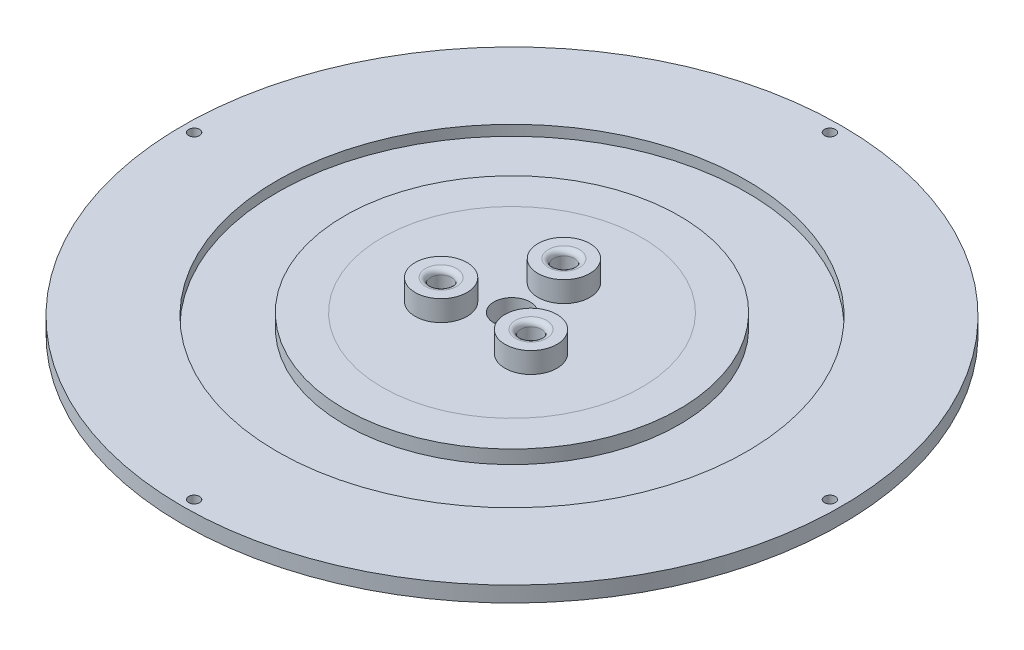
ISO-10303-21;
HEADER;
FILE_DESCRIPTION(('STEP AP214'),'2;1');
FILE_NAME('part.step','',(''),(''),'','','');
FILE_SCHEMA(('AUTOMOTIVE_DESIGN { 1 0 10303 214 1 1 1 1 }'));
ENDSEC;
DATA;
#1=APPLICATION_CONTEXT('core data for automotive mechanical design processes');
#2=APPLICATION_PROTOCOL_DEFINITION('international standard','automotive_design',2000,#1);
#3=PRODUCT_CONTEXT('',#1,'mechanical');
#4=PRODUCT('Part','Part','',(#3));
#5=PRODUCT_RELATED_PRODUCT_CATEGORY('part','',(#4));
#6=PRODUCT_DEFINITION_FORMATION('','',#4);
#7=PRODUCT_DEFINITION_CONTEXT('part definition',#1,'design');
#8=PRODUCT_DEFINITION('design','',#6,#7);
#9=PRODUCT_DEFINITION_SHAPE('','',#8);
#10=(LENGTH_UNIT() NAMED_UNIT(*) SI_UNIT(.MILLI.,.METRE.));
#11=(NAMED_UNIT(*) PLANE_ANGLE_UNIT() SI_UNIT($,.RADIAN.));
#12=(NAMED_UNIT(*) SI_UNIT($,.STERADIAN.) SOLID_ANGLE_UNIT());
#13=UNCERTAINTY_MEASURE_WITH_UNIT(LENGTH_MEASURE(1.E-05),#10,'distance_accuracy_value','');
#14=(GEOMETRIC_REPRESENTATION_CONTEXT(3) GLOBAL_UNCERTAINTY_ASSIGNED_CONTEXT((#13)) GLOBAL_UNIT_ASSIGNED_CONTEXT((#10,
#11,#12)) REPRESENTATION_CONTEXT('',''));
#15=CARTESIAN_POINT('',(0.,0.,0.));
#16=DIRECTION('',(0.,0.,1.));
#17=DIRECTION('',(1.,0.,0.));
#18=AXIS2_PLACEMENT_3D('',#15,#16,#17);
#19=CARTESIAN_POINT('',(0.,14.6,0.));
#20=DIRECTION('',(0.,1.,0.));
#21=DIRECTION('',(0.,0.,1.));
#22=AXIS2_PLACEMENT_3D('',#19,#20,#21);
#23=PLANE('',#22);
#24=CARTESIAN_POINT('',(0.,14.6,0.));
#25=DIRECTION('',(0.,1.,0.));
#26=DIRECTION('',(0.,0.,1.));
#27=AXIS2_PLACEMENT_3D('',#24,#25,#26);
#28=CIRCLE('',#27,32.25);
#29=CARTESIAN_POINT('',(0.,14.6,32.25));
#30=VERTEX_POINT('',#29);
#31=EDGE_CURVE('E86',#30,#30,#28,.T.);
#32=ORIENTED_EDGE('',*,*,#31,.T.);
#33=EDGE_LOOP('',(#32));
#34=FACE_BOUND('',#33,.T.);
#35=CARTESIAN_POINT('',(0.,14.6,0.));
#36=DIRECTION('',(0.,1.,0.));
#37=DIRECTION('',(0.,0.,1.));
#38=AXIS2_PLACEMENT_3D('',#35,#36,#37);
#39=CIRCLE('',#38,25.);
#40=CARTESIAN_POINT('',(0.,14.6,25.));
#41=VERTEX_POINT('',#40);
#42=EDGE_CURVE('E11',#41,#41,#39,.F.);
#43=ORIENTED_EDGE('',*,*,#42,.T.);
#44=EDGE_LOOP('',(#43));
#45=FACE_BOUND('',#44,.T.);
#46=ADVANCED_FACE('F49',(#34,#45),#23,.T.);
#47=CARTESIAN_POINT('',(0.,6.,0.));
#48=DIRECTION('',(0.,1.,0.));
#49=DIRECTION('',(0.,0.,1.));
#50=AXIS2_PLACEMENT_3D('',#47,#48,#49);
#51=CYLINDRICAL_SURFACE('',#50,63.5);
#52=CARTESIAN_POINT('',(0.,14.,0.));
#53=DIRECTION('',(0.,1.,0.));
#54=DIRECTION('',(0.,0.,1.));
#55=AXIS2_PLACEMENT_3D('',#52,#53,#54);
#56=CIRCLE('',#55,63.5);
#57=CARTESIAN_POINT('',(0.,14.,63.5));
#58=VERTEX_POINT('',#57);
#59=EDGE_CURVE('E77',#58,#58,#56,.T.);
#60=ORIENTED_EDGE('',*,*,#59,.F.);
#61=EDGE_LOOP('',(#60));
#62=FACE_BOUND('',#61,.T.);
#63=CARTESIAN_POINT('',(0.,11.,0.));
#64=DIRECTION('',(0.,1.,0.));
#65=DIRECTION('',(0.,0.,1.));
#66=AXIS2_PLACEMENT_3D('',#63,#64,#65);
#67=CIRCLE('',#66,63.5);
#68=CARTESIAN_POINT('',(0.,11.,63.5));
#69=VERTEX_POINT('',#68);
#70=EDGE_CURVE('E83',#69,#69,#67,.F.);
#71=ORIENTED_EDGE('',*,*,#70,.F.);
#72=EDGE_LOOP('',(#71));
#73=FACE_BOUND('',#72,.T.);
#74=ADVANCED_FACE('F163',(#62,#73),#51,.T.);
#75=ORIENTED_EDGE('',*,*,#42,.F.);
#76=EDGE_LOOP('',(#75));
#77=FACE_BOUND('',#76,.T.);
#78=CARTESIAN_POINT('',(0.,14.6,0.));
#79=DIRECTION('',(0.,1.,0.));
#80=DIRECTION('',(0.,0.,1.));
#81=AXIS2_PLACEMENT_3D('',#78,#79,#80);
#82=CIRCLE('',#81,3.5);
#83=CARTESIAN_POINT('',(0.,14.6,3.5));
#84=VERTEX_POINT('',#83);
#85=EDGE_CURVE('E82',#84,#84,#82,.T.);
#86=ORIENTED_EDGE('',*,*,#85,.F.);
#87=EDGE_LOOP('',(#86));
#88=FACE_BOUND('',#87,.T.);
#89=CARTESIAN_POINT('',(0.,14.6,-10.));
#90=DIRECTION('',(0.,1.,0.));
#91=DIRECTION('',(0.,0.,1.));
#92=AXIS2_PLACEMENT_3D('',#89,#90,#91);
#93=CIRCLE('',#92,5.);
#94=CARTESIAN_POINT('',(0.,14.6,-5.));
#95=VERTEX_POINT('',#94);
#96=EDGE_CURVE('E185',#95,#95,#93,.T.);
#97=ORIENTED_EDGE('',*,*,#96,.F.);
#98=EDGE_LOOP('',(#97));
#99=FACE_BOUND('',#98,.T.);
#100=CARTESIAN_POINT('',(-8.66025403784437,14.6,5.00000000000004));
#101=DIRECTION('',(0.,1.,0.));
#102=DIRECTION('',(0.866025403784436,0.,-0.500000000000004));
#103=AXIS2_PLACEMENT_3D('',#100,#101,#102);
#104=CIRCLE('',#103,5.);
#105=CARTESIAN_POINT('',(-4.33012701892218,14.6,2.50000000000002));
#106=VERTEX_POINT('',#105);
#107=EDGE_CURVE('E189',#106,#106,#104,.T.);
#108=ORIENTED_EDGE('',*,*,#107,.F.);
#109=EDGE_LOOP('',(#108));
#110=FACE_BOUND('',#109,.T.);
#111=CARTESIAN_POINT('',(8.66025403784443,14.6,4.99999999999992));
#112=DIRECTION('',(0.,1.,0.));
#113=DIRECTION('',(-0.866025403784443,0.,-0.499999999999992));
#114=AXIS2_PLACEMENT_3D('',#111,#112,#113);
#115=CIRCLE('',#114,5.);
#116=CARTESIAN_POINT('',(4.33012701892222,14.6,2.49999999999996));
#117=VERTEX_POINT('',#116);
#118=EDGE_CURVE('E192',#117,#117,#115,.T.);
#119=ORIENTED_EDGE('',*,*,#118,.F.);
#120=EDGE_LOOP('',(#119));
#121=FACE_BOUND('',#120,.T.);
#122=ADVANCED_FACE('F152',(#77,#88,#99,#110,#121),#23,.T.);
#123=CARTESIAN_POINT('',(0.,14.,0.));
#124=DIRECTION('',(0.,1.,0.));
#125=DIRECTION('',(0.,0.,1.));
#126=AXIS2_PLACEMENT_3D('',#123,#124,#125);
#127=PLANE('',#126);
#128=CARTESIAN_POINT('',(0.,14.,61.25));
#129=DIRECTION('',(0.,1.,0.));
#130=DIRECTION('',(0.,0.,1.));
#131=AXIS2_PLACEMENT_3D('',#128,#129,#130);
#132=CIRCLE('',#131,1.05);
#133=CARTESIAN_POINT('',(0.,14.,62.3));
#134=VERTEX_POINT('',#133);
#135=EDGE_CURVE('E447',#134,#134,#132,.T.);
#136=ORIENTED_EDGE('',*,*,#135,.F.);
#137=EDGE_LOOP('',(#136));
#138=FACE_BOUND('',#137,.T.);
#139=CARTESIAN_POINT('',(-61.25,14.,0.));
#140=DIRECTION('',(0.,1.,0.));
#141=DIRECTION('',(0.,0.,1.));
#142=AXIS2_PLACEMENT_3D('',#139,#140,#141);
#143=CIRCLE('',#142,1.05);
#144=CARTESIAN_POINT('',(-61.25,14.,1.05000000000002));
#145=VERTEX_POINT('',#144);
#146=EDGE_CURVE('E455',#145,#145,#143,.T.);
#147=ORIENTED_EDGE('',*,*,#146,.F.);
#148=EDGE_LOOP('',(#147));
#149=FACE_BOUND('',#148,.T.);
#150=CARTESIAN_POINT('',(0.,14.,-61.25));
#151=DIRECTION('',(0.,1.,0.));
#152=DIRECTION('',(0.,0.,1.));
#153=AXIS2_PLACEMENT_3D('',#150,#151,#152);
#154=CIRCLE('',#153,1.05);
#155=CARTESIAN_POINT('',(0.,14.,-60.2));
#156=VERTEX_POINT('',#155);
#157=EDGE_CURVE('E465',#156,#156,#154,.T.);
#158=ORIENTED_EDGE('',*,*,#157,.F.);
#159=EDGE_LOOP('',(#158));
#160=FACE_BOUND('',#159,.T.);
#161=CARTESIAN_POINT('',(61.25,14.,0.));
#162=DIRECTION('',(0.,1.,0.));
#163=DIRECTION('',(0.,0.,1.));
#164=AXIS2_PLACEMENT_3D('',#161,#162,#163);
#165=CIRCLE('',#164,1.05);
#166=CARTESIAN_POINT('',(61.25,14.,1.04999999999998));
#167=VERTEX_POINT('',#166);
#168=EDGE_CURVE('E473',#167,#167,#165,.T.);
#169=ORIENTED_EDGE('',*,*,#168,.F.);
#170=EDGE_LOOP('',(#169));
#171=FACE_BOUND('',#170,.T.);
#172=ORIENTED_EDGE('',*,*,#59,.T.);
#173=EDGE_LOOP('',(#172));
#174=FACE_BOUND('',#173,.T.);
#175=CARTESIAN_POINT('',(0.,14.,0.));
#176=DIRECTION('',(0.,1.,0.));
#177=DIRECTION('',(0.,0.,1.));
#178=AXIS2_PLACEMENT_3D('',#175,#176,#177);
#179=CIRCLE('',#178,45.25);
#180=CARTESIAN_POINT('',(0.,14.,45.25));
#181=VERTEX_POINT('',#180);
#182=EDGE_CURVE('E73',#181,#181,#179,.T.);
#183=ORIENTED_EDGE('',*,*,#182,.F.);
#184=EDGE_LOOP('',(#183));
#185=FACE_BOUND('',#184,.T.);
#186=ADVANCED_FACE('F51',(#138,#149,#160,#171,#174,#185),#127,.T.);
#187=CARTESIAN_POINT('',(0.,11.,0.));
#188=DIRECTION('',(0.,1.,0.));
#189=DIRECTION('',(0.,0.,1.));
#190=AXIS2_PLACEMENT_3D('',#187,#188,#189);
#191=PLANE('',#190);
#192=CARTESIAN_POINT('',(0.,11.,61.25));
#193=DIRECTION('',(0.,1.,0.));
#194=DIRECTION('',(0.,0.,1.));
#195=AXIS2_PLACEMENT_3D('',#192,#193,#194);
#196=CIRCLE('',#195,1.05);
#197=CARTESIAN_POINT('',(0.,11.,62.3));
#198=VERTEX_POINT('',#197);
#199=EDGE_CURVE('E87',#198,#198,#196,.T.);
#200=ORIENTED_EDGE('',*,*,#199,.T.);
#201=EDGE_LOOP('',(#200));
#202=FACE_BOUND('',#201,.T.);
#203=CARTESIAN_POINT('',(-61.25,11.,0.));
#204=DIRECTION('',(0.,1.,0.));
#205=DIRECTION('',(0.,0.,1.));
#206=AXIS2_PLACEMENT_3D('',#203,#204,#205);
#207=CIRCLE('',#206,1.05);
#208=CARTESIAN_POINT('',(-61.25,11.,1.05000000000002));
#209=VERTEX_POINT('',#208);
#210=EDGE_CURVE('E449',#209,#209,#207,.T.);
#211=ORIENTED_EDGE('',*,*,#210,.T.);
#212=EDGE_LOOP('',(#211));
#213=FACE_BOUND('',#212,.T.);
#214=CARTESIAN_POINT('',(0.,11.,-61.25));
#215=DIRECTION('',(0.,1.,0.));
#216=DIRECTION('',(0.,0.,1.));
#217=AXIS2_PLACEMENT_3D('',#214,#215,#216);
#218=CIRCLE('',#217,1.05);
#219=CARTESIAN_POINT('',(0.,11.,-60.2));
#220=VERTEX_POINT('',#219);
#221=EDGE_CURVE('E461',#220,#220,#218,.T.);
#222=ORIENTED_EDGE('',*,*,#221,.T.);
#223=EDGE_LOOP('',(#222));
#224=FACE_BOUND('',#223,.T.);
#225=CARTESIAN_POINT('',(61.25,11.,0.));
#226=DIRECTION('',(0.,1.,0.));
#227=DIRECTION('',(0.,0.,1.));
#228=AXIS2_PLACEMENT_3D('',#225,#226,#227);
#229=CIRCLE('',#228,1.05);
#230=CARTESIAN_POINT('',(61.25,11.,1.04999999999998));
#231=VERTEX_POINT('',#230);
#232=EDGE_CURVE('E469',#231,#231,#229,.T.);
#233=ORIENTED_EDGE('',*,*,#232,.T.);
#234=EDGE_LOOP('',(#233));
#235=FACE_BOUND('',#234,.T.);
#236=CARTESIAN_POINT('',(0.,11.,0.));
#237=DIRECTION('',(0.,1.,0.));
#238=DIRECTION('',(0.,0.,1.));
#239=AXIS2_PLACEMENT_3D('',#236,#237,#238);
#240=CIRCLE('',#239,3.5);
#241=CARTESIAN_POINT('',(0.,11.,3.5));
#242=VERTEX_POINT('',#241);
#243=EDGE_CURVE('E78',#242,#242,#240,.T.);
#244=ORIENTED_EDGE('',*,*,#243,.T.);
#245=EDGE_LOOP('',(#244));
#246=FACE_BOUND('',#245,.T.);
#247=ORIENTED_EDGE('',*,*,#70,.T.);
#248=EDGE_LOOP('',(#247));
#249=FACE_BOUND('',#248,.T.);
#250=ADVANCED_FACE('F176',(#202,#213,#224,#235,#246,#249),#191,.F.);
#251=CARTESIAN_POINT('',(0.,16.6,0.));
#252=DIRECTION('',(0.,-1.,0.));
#253=DIRECTION('',(0.,0.,-1.));
#254=AXIS2_PLACEMENT_3D('',#251,#252,#253);
#255=CYLINDRICAL_SURFACE('',#254,45.25);
#256=ORIENTED_EDGE('',*,*,#182,.T.);
#257=EDGE_LOOP('',(#256));
#258=FACE_BOUND('',#257,.T.);
#259=CARTESIAN_POINT('',(0.,12.,0.));
#260=DIRECTION('',(0.,1.,0.));
#261=DIRECTION('',(0.,0.,1.));
#262=AXIS2_PLACEMENT_3D('',#259,#260,#261);
#263=CIRCLE('',#262,45.25);
#264=CARTESIAN_POINT('',(0.,12.,45.25));
#265=VERTEX_POINT('',#264);
#266=EDGE_CURVE('E196',#265,#265,#263,.T.);
#267=ORIENTED_EDGE('',*,*,#266,.F.);
#268=EDGE_LOOP('',(#267));
#269=FACE_BOUND('',#268,.T.);
#270=ADVANCED_FACE('F234',(#258,#269),#255,.F.);
#271=CARTESIAN_POINT('',(0.,6.,0.));
#272=DIRECTION('',(0.,1.,0.));
#273=DIRECTION('',(0.,0.,1.));
#274=AXIS2_PLACEMENT_3D('',#271,#272,#273);
#275=CYLINDRICAL_SURFACE('',#274,3.5);
#276=CARTESIAN_POINT('',(0.,14.6,3.5));
#277=CARTESIAN_POINT('',(0.,14.5625,3.5));
#278=CARTESIAN_POINT('',(0.,14.525,3.5));
#279=CARTESIAN_POINT('',(0.,14.45,3.5));
#280=CARTESIAN_POINT('',(0.,14.4125,3.5));
#281=CARTESIAN_POINT('',(0.,14.3375,3.5));
#282=CARTESIAN_POINT('',(0.,14.3,3.5));
#283=CARTESIAN_POINT('',(0.,14.225,3.5));
#284=CARTESIAN_POINT('',(0.,14.1875,3.5));
#285=CARTESIAN_POINT('',(0.,14.1125,3.5));
#286=CARTESIAN_POINT('',(0.,14.075,3.5));
#287=CARTESIAN_POINT('',(0.,14.,3.5));
#288=CARTESIAN_POINT('',(0.,13.9625,3.5));
#289=CARTESIAN_POINT('',(0.,13.8875,3.5));
#290=CARTESIAN_POINT('',(0.,13.85,3.5));
#291=CARTESIAN_POINT('',(0.,13.775,3.5));
#292=CARTESIAN_POINT('',(0.,13.7375,3.5));
#293=CARTESIAN_POINT('',(0.,13.6625,3.5));
#294=CARTESIAN_POINT('',(0.,13.625,3.5));
#295=CARTESIAN_POINT('',(0.,13.55,3.5));
#296=CARTESIAN_POINT('',(0.,13.5125,3.5));
#297=CARTESIAN_POINT('',(0.,13.4375,3.5));
#298=CARTESIAN_POINT('',(0.,13.4,3.5));
#299=CARTESIAN_POINT('',(0.,13.325,3.5));
#300=CARTESIAN_POINT('',(0.,13.2875,3.5));
#301=CARTESIAN_POINT('',(0.,13.2125,3.5));
#302=CARTESIAN_POINT('',(0.,13.175,3.5));
#303=CARTESIAN_POINT('',(0.,13.1,3.5));
#304=CARTESIAN_POINT('',(0.,13.0625,3.5));
#305=CARTESIAN_POINT('',(0.,12.9875,3.5));
#306=CARTESIAN_POINT('',(0.,12.95,3.5));
#307=CARTESIAN_POINT('',(0.,12.875,3.5));
#308=CARTESIAN_POINT('',(0.,12.8375,3.5));
#309=CARTESIAN_POINT('',(0.,12.7625,3.5));
#310=CARTESIAN_POINT('',(0.,12.725,3.5));
#311=CARTESIAN_POINT('',(0.,12.65,3.5));
#312=CARTESIAN_POINT('',(0.,12.6125,3.5));
#313=CARTESIAN_POINT('',(0.,12.5375,3.5));
#314=CARTESIAN_POINT('',(0.,12.5,3.5));
#315=CARTESIAN_POINT('',(0.,12.425,3.5));
#316=CARTESIAN_POINT('',(0.,12.3875,3.5));
#317=CARTESIAN_POINT('',(0.,12.3125,3.5));
#318=CARTESIAN_POINT('',(0.,12.275,3.5));
#319=CARTESIAN_POINT('',(0.,12.2,3.5));
#320=CARTESIAN_POINT('',(0.,12.1625,3.5));
#321=CARTESIAN_POINT('',(0.,12.0875,3.5));
#322=CARTESIAN_POINT('',(0.,12.05,3.5));
#323=CARTESIAN_POINT('',(0.,11.975,3.5));
#324=CARTESIAN_POINT('',(0.,11.9375,3.5));
#325=CARTESIAN_POINT('',(0.,11.8625,3.5));
#326=CARTESIAN_POINT('',(0.,11.825,3.5));
#327=CARTESIAN_POINT('',(0.,11.75,3.5));
#328=CARTESIAN_POINT('',(0.,11.7125,3.5));
#329=CARTESIAN_POINT('',(0.,11.6375,3.5));
#330=CARTESIAN_POINT('',(0.,11.6,3.5));
#331=CARTESIAN_POINT('',(0.,11.525,3.5));
#332=CARTESIAN_POINT('',(0.,11.4875,3.5));
#333=CARTESIAN_POINT('',(0.,11.4125,3.5));
#334=CARTESIAN_POINT('',(0.,11.375,3.5));
#335=CARTESIAN_POINT('',(0.,11.3,3.5));
#336=CARTESIAN_POINT('',(0.,11.2625,3.5));
#337=CARTESIAN_POINT('',(0.,11.1875,3.5));
#338=CARTESIAN_POINT('',(0.,11.15,3.5));
#339=CARTESIAN_POINT('',(0.,11.075,3.5));
#340=CARTESIAN_POINT('',(0.,11.0375,3.5));
#341=CARTESIAN_POINT('',(0.,11.,3.5));
#342=B_SPLINE_CURVE_WITH_KNOTS('',3,(#276,#277,#278,#279,#280,#281,#282,#283,#284,#285,#286,
#287,#288,#289,#290,#291,#292,#293,#294,#295,#296,#297,#298,#299,#300,#301,#302,#303,#304,#305,
#306,#307,#308,#309,#310,#311,#312,#313,#314,#315,#316,#317,#318,#319,#320,#321,#322,#323,#324,
#325,#326,#327,#328,#329,#330,#331,#332,#333,#334,#335,#336,#337,#338,#339,#340,#341),
.UNSPECIFIED.,.F.,.F.,(4,2,2,2,2,2,2,2,2,2,2,2,2,2,2,2,2,2,2,2,2,2,2,2,2,2,2,2,2,2,2,2,4),(0.,
0.1125,0.225,0.337499999999999,0.450000000000001,0.5625,0.675,0.7875,0.899999999999998,1.0125,
1.125,1.2375,1.35,1.4625,1.575,1.6875,1.8,1.9125,2.025,2.1375,2.25,2.3625,2.475,2.5875,2.7,
2.8125,2.925,3.0375,3.15,3.2625,3.375,3.4875,3.6),.UNSPECIFIED.);
#343=EDGE_CURVE('BSEAM228',#84,#242,#342,.T.);
#344=ORIENTED_EDGE('',*,*,#85,.T.);
#345=ORIENTED_EDGE('',*,*,#243,.F.);
#346=ORIENTED_EDGE('',*,*,#343,.T.);
#347=ORIENTED_EDGE('',*,*,#343,.F.);
#348=EDGE_LOOP('',(#344,#346,#345,#347));
#349=FACE_BOUND('',#348,.T.);
#350=ADVANCED_FACE('F228',(#349),#275,.F.);
#351=CARTESIAN_POINT('',(0.,18.6,-10.));
#352=DIRECTION('',(0.,1.,0.));
#353=DIRECTION('',(0.,0.,1.));
#354=AXIS2_PLACEMENT_3D('',#351,#352,#353);
#355=PLANE('',#354);
#356=CARTESIAN_POINT('',(0.,18.6,-10.));
#357=DIRECTION('',(0.,1.,0.));
#358=DIRECTION('',(0.,0.,1.));
#359=AXIS2_PLACEMENT_3D('',#356,#357,#358);
#360=CIRCLE('',#359,3.);
#361=CARTESIAN_POINT('',(0.,18.6,-7.));
#362=VERTEX_POINT('',#361);
#363=EDGE_CURVE('E101',#362,#362,#360,.F.);
#364=ORIENTED_EDGE('',*,*,#363,.T.);
#365=EDGE_LOOP('',(#364));
#366=FACE_BOUND('',#365,.T.);
#367=CARTESIAN_POINT('',(0.,18.6,-10.));
#368=DIRECTION('',(0.,1.,0.));
#369=DIRECTION('',(0.,0.,1.));
#370=AXIS2_PLACEMENT_3D('',#367,#368,#369);
#371=CIRCLE('',#370,5.);
#372=CARTESIAN_POINT('',(0.,18.6,-5.));
#373=VERTEX_POINT('',#372);
#374=EDGE_CURVE('E212',#373,#373,#371,.T.);
#375=ORIENTED_EDGE('',*,*,#374,.T.);
#376=EDGE_LOOP('',(#375));
#377=FACE_BOUND('',#376,.T.);
#378=ADVANCED_FACE('F219',(#366,#377),#355,.T.);
#379=CARTESIAN_POINT('',(0.,18.6,-10.));
#380=DIRECTION('',(0.,-1.,0.));
#381=DIRECTION('',(0.,0.,-1.));
#382=AXIS2_PLACEMENT_3D('',#379,#380,#381);
#383=CYLINDRICAL_SURFACE('',#382,5.);
#384=ORIENTED_EDGE('',*,*,#374,.F.);
#385=EDGE_LOOP('',(#384));
#386=FACE_BOUND('',#385,.T.);
#387=ORIENTED_EDGE('',*,*,#96,.T.);
#388=EDGE_LOOP('',(#387));
#389=FACE_BOUND('',#388,.T.);
#390=ADVANCED_FACE('F217',(#386,#389),#383,.T.);
#391=CARTESIAN_POINT('',(0.,18.6,-10.));
#392=DIRECTION('',(0.,-1.,0.));
#393=DIRECTION('',(0.,0.,-1.));
#394=AXIS2_PLACEMENT_3D('',#391,#392,#393);
#395=CYLINDRICAL_SURFACE('',#394,2.);
#396=CARTESIAN_POINT('',(0.,17.6,-10.));
#397=DIRECTION('',(0.,1.,0.));
#398=DIRECTION('',(0.,0.,1.));
#399=AXIS2_PLACEMENT_3D('',#396,#397,#398);
#400=CIRCLE('',#399,2.);
#401=CARTESIAN_POINT('',(0.,17.6,-8.));
#402=VERTEX_POINT('',#401);
#403=EDGE_CURVE('E95',#402,#402,#400,.T.);
#404=ORIENTED_EDGE('',*,*,#403,.T.);
#405=EDGE_LOOP('',(#404));
#406=FACE_BOUND('',#405,.T.);
#407=CARTESIAN_POINT('',(0.,14.6,-10.));
#408=DIRECTION('',(0.,1.,0.));
#409=DIRECTION('',(0.,0.,1.));
#410=AXIS2_PLACEMENT_3D('',#407,#408,#409);
#411=CIRCLE('',#410,2.);
#412=CARTESIAN_POINT('',(0.,14.6,-8.));
#413=VERTEX_POINT('',#412);
#414=EDGE_CURVE('E90',#413,#413,#411,.F.);
#415=ORIENTED_EDGE('',*,*,#414,.T.);
#416=EDGE_LOOP('',(#415));
#417=FACE_BOUND('',#416,.T.);
#418=ADVANCED_FACE('F157',(#406,#417),#395,.F.);
#419=ORIENTED_EDGE('',*,*,#414,.F.);
#420=EDGE_LOOP('',(#419));
#421=FACE_BOUND('',#420,.T.);
#422=ADVANCED_FACE('F146',(#421),#23,.T.);
#423=CARTESIAN_POINT('',(0.,17.6,-10.));
#424=DIRECTION('',(0.,1.,0.));
#425=DIRECTION('',(0.,0.,1.));
#426=AXIS2_PLACEMENT_3D('',#423,#424,#425);
#427=TOROIDAL_SURFACE('',#426,3.,1.);
#428=ORIENTED_EDGE('',*,*,#363,.F.);
#429=EDGE_LOOP('',(#428));
#430=FACE_BOUND('',#429,.T.);
#431=ORIENTED_EDGE('',*,*,#403,.F.);
#432=EDGE_LOOP('',(#431));
#433=FACE_BOUND('',#432,.T.);
#434=ADVANCED_FACE('F156',(#430,#433),#427,.T.);
#435=CARTESIAN_POINT('',(-8.66025403784437,18.6,5.00000000000004));
#436=DIRECTION('',(0.,1.,0.));
#437=DIRECTION('',(0.866025403784436,0.,-0.500000000000004));
#438=AXIS2_PLACEMENT_3D('',#435,#436,#437);
#439=PLANE('',#438);
#440=CARTESIAN_POINT('',(-8.66025403784437,18.6,5.00000000000004));
#441=DIRECTION('',(0.,1.,0.));
#442=DIRECTION('',(0.,0.,1.));
#443=AXIS2_PLACEMENT_3D('',#440,#441,#442);
#444=CIRCLE('',#443,3.);
#445=CARTESIAN_POINT('',(-8.66025403784437,18.6,8.00000000000004));
#446=VERTEX_POINT('',#445);
#447=EDGE_CURVE('E69',#446,#446,#444,.F.);
#448=ORIENTED_EDGE('',*,*,#447,.T.);
#449=EDGE_LOOP('',(#448));
#450=FACE_BOUND('',#449,.T.);
#451=CARTESIAN_POINT('',(-8.66025403784437,18.6,5.00000000000004));
#452=DIRECTION('',(0.,1.,0.));
#453=DIRECTION('',(0.866025403784436,0.,-0.500000000000004));
#454=AXIS2_PLACEMENT_3D('',#451,#452,#453);
#455=CIRCLE('',#454,5.);
#456=CARTESIAN_POINT('',(-4.33012701892218,18.6,2.50000000000002));
#457=VERTEX_POINT('',#456);
#458=EDGE_CURVE('E206',#457,#457,#455,.T.);
#459=ORIENTED_EDGE('',*,*,#458,.T.);
#460=EDGE_LOOP('',(#459));
#461=FACE_BOUND('',#460,.T.);
#462=ADVANCED_FACE('F124',(#450,#461),#439,.T.);
#463=CARTESIAN_POINT('',(-8.66025403784437,18.6,5.00000000000004));
#464=DIRECTION('',(0.,-1.,0.));
#465=DIRECTION('',(0.,0.,-1.));
#466=AXIS2_PLACEMENT_3D('',#463,#464,#465);
#467=CYLINDRICAL_SURFACE('',#466,5.);
#468=ORIENTED_EDGE('',*,*,#458,.F.);
#469=EDGE_LOOP('',(#468));
#470=FACE_BOUND('',#469,.T.);
#471=ORIENTED_EDGE('',*,*,#107,.T.);
#472=EDGE_LOOP('',(#471));
#473=FACE_BOUND('',#472,.T.);
#474=ADVANCED_FACE('F139',(#470,#473),#467,.T.);
#475=CARTESIAN_POINT('',(-8.66025403784437,18.6,5.00000000000004));
#476=DIRECTION('',(0.,-1.,0.));
#477=DIRECTION('',(0.,0.,-1.));
#478=AXIS2_PLACEMENT_3D('',#475,#476,#477);
#479=CYLINDRICAL_SURFACE('',#478,2.);
#480=CARTESIAN_POINT('',(-8.66025403784437,17.6,5.00000000000004));
#481=DIRECTION('',(0.,1.,0.));
#482=DIRECTION('',(0.,0.,1.));
#483=AXIS2_PLACEMENT_3D('',#480,#481,#482);
#484=CIRCLE('',#483,2.);
#485=CARTESIAN_POINT('',(-8.66025403784437,17.6,7.00000000000004));
#486=VERTEX_POINT('',#485);
#487=EDGE_CURVE('E117',#486,#486,#484,.T.);
#488=ORIENTED_EDGE('',*,*,#487,.T.);
#489=EDGE_LOOP('',(#488));
#490=FACE_BOUND('',#489,.T.);
#491=CARTESIAN_POINT('',(-8.66025403784437,14.6,5.00000000000004));
#492=DIRECTION('',(0.,1.,0.));
#493=DIRECTION('',(0.,0.,1.));
#494=AXIS2_PLACEMENT_3D('',#491,#492,#493);
#495=CIRCLE('',#494,2.);
#496=CARTESIAN_POINT('',(-8.66025403784437,14.6,7.00000000000004));
#497=VERTEX_POINT('',#496);
#498=EDGE_CURVE('E109',#497,#497,#495,.F.);
#499=ORIENTED_EDGE('',*,*,#498,.T.);
#500=EDGE_LOOP('',(#499));
#501=FACE_BOUND('',#500,.T.);
#502=ADVANCED_FACE('F135',(#490,#501),#479,.F.);
#503=ORIENTED_EDGE('',*,*,#498,.F.);
#504=EDGE_LOOP('',(#503));
#505=FACE_BOUND('',#504,.T.);
#506=ADVANCED_FACE('F138',(#505),#23,.T.);
#507=CARTESIAN_POINT('',(8.66025403784443,18.6,4.99999999999992));
#508=DIRECTION('',(0.,1.,0.));
#509=DIRECTION('',(-0.866025403784443,0.,-0.499999999999992));
#510=AXIS2_PLACEMENT_3D('',#507,#508,#509);
#511=PLANE('',#510);
#512=CARTESIAN_POINT('',(8.66025403784443,18.6,4.99999999999992));
#513=DIRECTION('',(0.,1.,0.));
#514=DIRECTION('',(0.,0.,1.));
#515=AXIS2_PLACEMENT_3D('',#512,#513,#514);
#516=CIRCLE('',#515,3.);
#517=CARTESIAN_POINT('',(8.66025403784443,18.6,7.99999999999992));
#518=VERTEX_POINT('',#517);
#519=EDGE_CURVE('E57',#518,#518,#516,.F.);
#520=ORIENTED_EDGE('',*,*,#519,.T.);
#521=EDGE_LOOP('',(#520));
#522=FACE_BOUND('',#521,.T.);
#523=CARTESIAN_POINT('',(8.66025403784443,18.6,4.99999999999992));
#524=DIRECTION('',(0.,1.,0.));
#525=DIRECTION('',(-0.866025403784443,0.,-0.499999999999992));
#526=AXIS2_PLACEMENT_3D('',#523,#524,#525);
#527=CIRCLE('',#526,5.);
#528=CARTESIAN_POINT('',(4.33012701892222,18.6,2.49999999999996));
#529=VERTEX_POINT('',#528);
#530=EDGE_CURVE('E195',#529,#529,#527,.T.);
#531=ORIENTED_EDGE('',*,*,#530,.T.);
#532=EDGE_LOOP('',(#531));
#533=FACE_BOUND('',#532,.T.);
#534=ADVANCED_FACE('F144',(#522,#533),#511,.T.);
#535=CARTESIAN_POINT('',(8.66025403784443,18.6,4.99999999999992));
#536=DIRECTION('',(0.,-1.,0.));
#537=DIRECTION('',(0.,0.,-1.));
#538=AXIS2_PLACEMENT_3D('',#535,#536,#537);
#539=CYLINDRICAL_SURFACE('',#538,5.);
#540=ORIENTED_EDGE('',*,*,#530,.F.);
#541=EDGE_LOOP('',(#540));
#542=FACE_BOUND('',#541,.T.);
#543=ORIENTED_EDGE('',*,*,#118,.T.);
#544=EDGE_LOOP('',(#543));
#545=FACE_BOUND('',#544,.T.);
#546=ADVANCED_FACE('F150',(#542,#545),#539,.T.);
#547=CARTESIAN_POINT('',(8.66025403784443,18.6,4.99999999999992));
#548=DIRECTION('',(0.,-1.,0.));
#549=DIRECTION('',(0.,0.,-1.));
#550=AXIS2_PLACEMENT_3D('',#547,#548,#549);
#551=CYLINDRICAL_SURFACE('',#550,2.);
#552=CARTESIAN_POINT('',(8.66025403784443,17.6,4.99999999999992));
#553=DIRECTION('',(0.,1.,0.));
#554=DIRECTION('',(0.,0.,1.));
#555=AXIS2_PLACEMENT_3D('',#552,#553,#554);
#556=CIRCLE('',#555,2.);
#557=CARTESIAN_POINT('',(8.66025403784443,17.6,6.99999999999992));
#558=VERTEX_POINT('',#557);
#559=EDGE_CURVE('E63',#558,#558,#556,.T.);
#560=ORIENTED_EDGE('',*,*,#559,.T.);
#561=EDGE_LOOP('',(#560));
#562=FACE_BOUND('',#561,.T.);
#563=CARTESIAN_POINT('',(8.66025403784443,14.6,4.99999999999992));
#564=DIRECTION('',(0.,1.,0.));
#565=DIRECTION('',(0.,0.,1.));
#566=AXIS2_PLACEMENT_3D('',#563,#564,#565);
#567=CIRCLE('',#566,2.);
#568=CARTESIAN_POINT('',(8.66025403784443,14.6,6.99999999999992));
#569=VERTEX_POINT('',#568);
#570=EDGE_CURVE('E113',#569,#569,#567,.F.);
#571=ORIENTED_EDGE('',*,*,#570,.T.);
#572=EDGE_LOOP('',(#571));
#573=FACE_BOUND('',#572,.T.);
#574=ADVANCED_FACE('F160',(#562,#573),#551,.F.);
#575=ORIENTED_EDGE('',*,*,#570,.F.);
#576=EDGE_LOOP('',(#575));
#577=FACE_BOUND('',#576,.T.);
#578=ADVANCED_FACE('F131',(#577),#23,.T.);
#579=CARTESIAN_POINT('',(-8.66025403784437,17.6,5.00000000000004));
#580=DIRECTION('',(0.,1.,0.));
#581=DIRECTION('',(0.,0.,1.));
#582=AXIS2_PLACEMENT_3D('',#579,#580,#581);
#583=TOROIDAL_SURFACE('',#582,3.,1.);
#584=ORIENTED_EDGE('',*,*,#447,.F.);
#585=EDGE_LOOP('',(#584));
#586=FACE_BOUND('',#585,.T.);
#587=ORIENTED_EDGE('',*,*,#487,.F.);
#588=EDGE_LOOP('',(#587));
#589=FACE_BOUND('',#588,.T.);
#590=ADVANCED_FACE('F127',(#586,#589),#583,.T.);
#591=CARTESIAN_POINT('',(8.66025403784443,17.6,4.99999999999992));
#592=DIRECTION('',(0.,1.,0.));
#593=DIRECTION('',(0.,0.,1.));
#594=AXIS2_PLACEMENT_3D('',#591,#592,#593);
#595=TOROIDAL_SURFACE('',#594,3.,1.);
#596=ORIENTED_EDGE('',*,*,#519,.F.);
#597=EDGE_LOOP('',(#596));
#598=FACE_BOUND('',#597,.T.);
#599=ORIENTED_EDGE('',*,*,#559,.F.);
#600=EDGE_LOOP('',(#599));
#601=FACE_BOUND('',#600,.T.);
#602=ADVANCED_FACE('F130',(#598,#601),#595,.T.);
#603=CARTESIAN_POINT('',(0.,12.,0.));
#604=DIRECTION('',(0.,1.,0.));
#605=DIRECTION('',(0.,0.,1.));
#606=AXIS2_PLACEMENT_3D('',#603,#604,#605);
#607=PLANE('',#606);
#608=CARTESIAN_POINT('',(0.,12.,0.));
#609=DIRECTION('',(0.,1.,0.));
#610=DIRECTION('',(0.,0.,1.));
#611=AXIS2_PLACEMENT_3D('',#608,#609,#610);
#612=CIRCLE('',#611,32.25);
#613=CARTESIAN_POINT('',(0.,12.,32.25));
#614=VERTEX_POINT('',#613);
#615=EDGE_CURVE('E203',#614,#614,#612,.T.);
#616=ORIENTED_EDGE('',*,*,#615,.F.);
#617=EDGE_LOOP('',(#616));
#618=FACE_BOUND('',#617,.T.);
#619=ORIENTED_EDGE('',*,*,#266,.T.);
#620=EDGE_LOOP('',(#619));
#621=FACE_BOUND('',#620,.T.);
#622=ADVANCED_FACE('F247',(#618,#621),#607,.T.);
#623=CARTESIAN_POINT('',(0.,12.,0.));
#624=DIRECTION('',(0.,1.,0.));
#625=DIRECTION('',(0.,0.,1.));
#626=AXIS2_PLACEMENT_3D('',#623,#624,#625);
#627=CYLINDRICAL_SURFACE('',#626,32.25);
#628=ORIENTED_EDGE('',*,*,#615,.T.);
#629=EDGE_LOOP('',(#628));
#630=FACE_BOUND('',#629,.T.);
#631=ORIENTED_EDGE('',*,*,#31,.F.);
#632=EDGE_LOOP('',(#631));
#633=FACE_BOUND('',#632,.T.);
#634=ADVANCED_FACE('F249',(#630,#633),#627,.T.);
#635=CARTESIAN_POINT('',(61.25,11.,0.));
#636=DIRECTION('',(0.,1.,0.));
#637=DIRECTION('',(0.,0.,1.));
#638=AXIS2_PLACEMENT_3D('',#635,#636,#637);
#639=CYLINDRICAL_SURFACE('',#638,1.05);
#640=ORIENTED_EDGE('',*,*,#232,.F.);
#641=EDGE_LOOP('',(#640));
#642=FACE_BOUND('',#641,.T.);
#643=ORIENTED_EDGE('',*,*,#168,.T.);
#644=EDGE_LOOP('',(#643));
#645=FACE_BOUND('',#644,.T.);
#646=ADVANCED_FACE('F256',(#642,#645),#639,.F.);
#647=CARTESIAN_POINT('',(0.,11.,-61.25));
#648=DIRECTION('',(0.,1.,0.));
#649=DIRECTION('',(0.,0.,1.));
#650=AXIS2_PLACEMENT_3D('',#647,#648,#649);
#651=CYLINDRICAL_SURFACE('',#650,1.05);
#652=ORIENTED_EDGE('',*,*,#221,.F.);
#653=EDGE_LOOP('',(#652));
#654=FACE_BOUND('',#653,.T.);
#655=ORIENTED_EDGE('',*,*,#157,.T.);
#656=EDGE_LOOP('',(#655));
#657=FACE_BOUND('',#656,.T.);
#658=ADVANCED_FACE('F389',(#654,#657),#651,.F.);
#659=CARTESIAN_POINT('',(-61.25,11.,0.));
#660=DIRECTION('',(0.,1.,0.));
#661=DIRECTION('',(0.,0.,1.));
#662=AXIS2_PLACEMENT_3D('',#659,#660,#661);
#663=CYLINDRICAL_SURFACE('',#662,1.05);
#664=ORIENTED_EDGE('',*,*,#210,.F.);
#665=EDGE_LOOP('',(#664));
#666=FACE_BOUND('',#665,.T.);
#667=ORIENTED_EDGE('',*,*,#146,.T.);
#668=EDGE_LOOP('',(#667));
#669=FACE_BOUND('',#668,.T.);
#670=ADVANCED_FACE('F398',(#666,#669),#663,.F.);
#671=CARTESIAN_POINT('',(0.,11.,61.25));
#672=DIRECTION('',(0.,1.,0.));
#673=DIRECTION('',(0.,0.,1.));
#674=AXIS2_PLACEMENT_3D('',#671,#672,#673);
#675=CYLINDRICAL_SURFACE('',#674,1.05);
#676=ORIENTED_EDGE('',*,*,#199,.F.);
#677=EDGE_LOOP('',(#676));
#678=FACE_BOUND('',#677,.T.);
#679=ORIENTED_EDGE('',*,*,#135,.T.);
#680=EDGE_LOOP('',(#679));
#681=FACE_BOUND('',#680,.T.);
#682=ADVANCED_FACE('F408',(#678,#681),#675,.F.);
#683=CLOSED_SHELL('',(#46,#74,#122,#186,#250,#270,#350,#378,#390,#418,#422,#434,#462,#474,#502,
#506,#534,#546,#574,#578,#590,#602,#622,#634,#646,#658,#670,#682));
#684=MANIFOLD_SOLID_BREP('B2',#683);
#685=ADVANCED_BREP_SHAPE_REPRESENTATION('',(#18,#684),#14);
#686=SHAPE_DEFINITION_REPRESENTATION(#9,#685);
ENDSEC;
END-ISO-10303-21;
